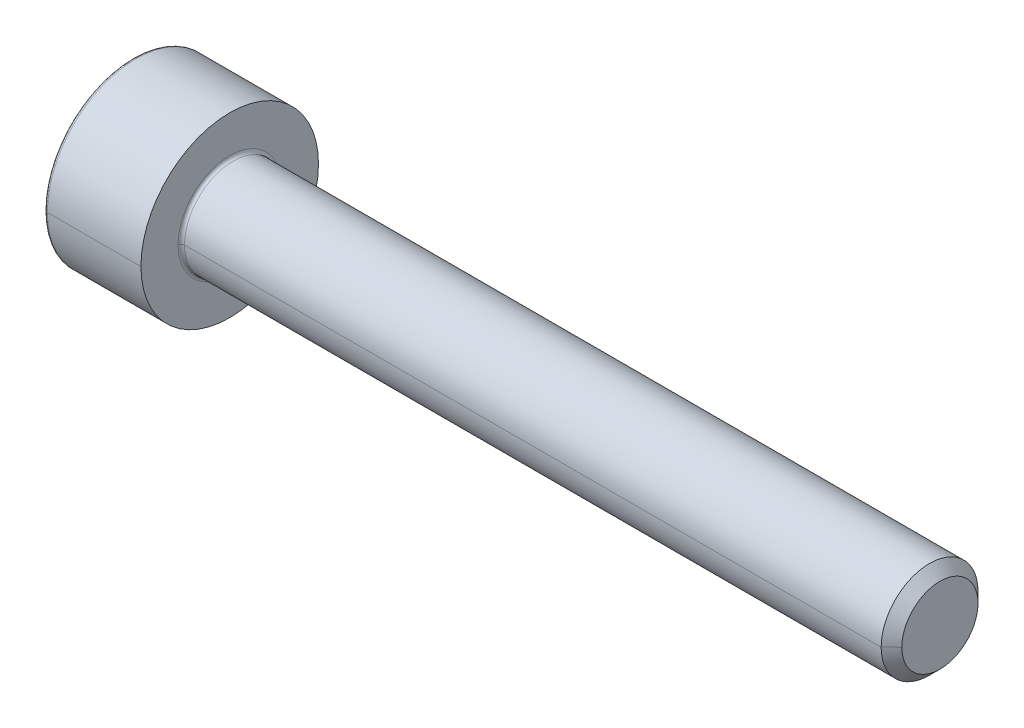
ISO-10303-21;
HEADER;
FILE_DESCRIPTION(('STEP AP214'),'2;1');
FILE_NAME('part.step','',(''),(''),'','','');
FILE_SCHEMA(('AUTOMOTIVE_DESIGN { 1 0 10303 214 1 1 1 1 }'));
ENDSEC;
DATA;
#1=APPLICATION_CONTEXT('core data for automotive mechanical design processes');
#2=APPLICATION_PROTOCOL_DEFINITION('international standard','automotive_design',2000,#1);
#3=PRODUCT_CONTEXT('',#1,'mechanical');
#4=PRODUCT('Part','Part','',(#3));
#5=PRODUCT_RELATED_PRODUCT_CATEGORY('part','',(#4));
#6=PRODUCT_DEFINITION_FORMATION('','',#4);
#7=PRODUCT_DEFINITION_CONTEXT('part definition',#1,'design');
#8=PRODUCT_DEFINITION('design','',#6,#7);
#9=PRODUCT_DEFINITION_SHAPE('','',#8);
#10=(LENGTH_UNIT() NAMED_UNIT(*) SI_UNIT(.MILLI.,.METRE.));
#11=(NAMED_UNIT(*) PLANE_ANGLE_UNIT() SI_UNIT($,.RADIAN.));
#12=(NAMED_UNIT(*) SI_UNIT($,.STERADIAN.) SOLID_ANGLE_UNIT());
#13=UNCERTAINTY_MEASURE_WITH_UNIT(LENGTH_MEASURE(1.E-05),#10,'distance_accuracy_value','');
#14=(GEOMETRIC_REPRESENTATION_CONTEXT(3) GLOBAL_UNCERTAINTY_ASSIGNED_CONTEXT((#13)) GLOBAL_UNIT_ASSIGNED_CONTEXT((#10,
#11,#12)) REPRESENTATION_CONTEXT('',''));
#15=CARTESIAN_POINT('',(0.,0.,0.));
#16=DIRECTION('',(0.,0.,1.));
#17=DIRECTION('',(1.,0.,0.));
#18=AXIS2_PLACEMENT_3D('',#15,#16,#17);
#19=CARTESIAN_POINT('',(1.3,-0.7175,1.242746454431));
#20=DIRECTION('',(-1.,0.,0.));
#21=DIRECTION('',(0.,0.,1.));
#22=AXIS2_PLACEMENT_3D('',#19,#20,#21);
#23=PLANE('',#22);
#24=DIRECTION('',(0.,-1.,0.));
#25=VECTOR('',#24,1.);
#26=CARTESIAN_POINT('',(1.3,0.7175,1.242746454431));
#27=LINE('',#26,#25);
#28=CARTESIAN_POINT('',(1.3,0.7175,1.242746454431));
#29=VERTEX_POINT('',#28);
#30=CARTESIAN_POINT('',(1.3,-0.7174999999999,1.242746454431));
#31=VERTEX_POINT('',#30);
#32=EDGE_CURVE('E30',#29,#31,#27,.T.);
#33=ORIENTED_EDGE('',*,*,#32,.F.);
#34=DIRECTION('',(0.,-0.499999999999973,0.866025403784454));
#35=VECTOR('',#34,1.);
#36=CARTESIAN_POINT('',(1.3,1.435,0.));
#37=LINE('',#36,#35);
#38=CARTESIAN_POINT('',(1.3,1.435,0.));
#39=VERTEX_POINT('',#38);
#40=EDGE_CURVE('E45',#39,#29,#37,.T.);
#41=ORIENTED_EDGE('',*,*,#40,.F.);
#42=DIRECTION('',(0.,0.500000000000017,0.866025403784429));
#43=VECTOR('',#42,1.);
#44=CARTESIAN_POINT('',(1.3,0.7174999999999,-1.242746454431));
#45=LINE('',#44,#43);
#46=CARTESIAN_POINT('',(1.3,0.7174999999999,-1.242746454431));
#47=VERTEX_POINT('',#46);
#48=EDGE_CURVE('E330',#47,#39,#45,.T.);
#49=ORIENTED_EDGE('',*,*,#48,.F.);
#50=DIRECTION('',(0.,1.,0.));
#51=VECTOR('',#50,1.);
#52=CARTESIAN_POINT('',(1.3,-0.7175,-1.242746454431));
#53=LINE('',#52,#51);
#54=CARTESIAN_POINT('',(1.3,-0.7175,-1.242746454431));
#55=VERTEX_POINT('',#54);
#56=EDGE_CURVE('E322',#55,#47,#53,.T.);
#57=ORIENTED_EDGE('',*,*,#56,.F.);
#58=DIRECTION('',(0.,0.499999999999973,-0.866025403784454));
#59=VECTOR('',#58,1.);
#60=CARTESIAN_POINT('',(1.3,-1.435,0.));
#61=LINE('',#60,#59);
#62=CARTESIAN_POINT('',(1.3,-1.435,0.));
#63=VERTEX_POINT('',#62);
#64=EDGE_CURVE('E301',#63,#55,#61,.T.);
#65=ORIENTED_EDGE('',*,*,#64,.F.);
#66=DIRECTION('',(0.,-0.500000000000017,-0.866025403784429));
#67=VECTOR('',#66,1.);
#68=CARTESIAN_POINT('',(1.3,-0.7174999999999,1.242746454431));
#69=LINE('',#68,#67);
#70=EDGE_CURVE('E383',#31,#63,#69,.T.);
#71=ORIENTED_EDGE('',*,*,#70,.F.);
#72=EDGE_LOOP('',(#33,#41,#49,#57,#65,#71));
#73=FACE_BOUND('',#72,.T.);
#74=ADVANCED_FACE('F17',(#73),#23,.T.);
#75=CARTESIAN_POINT('',(1.3,-0.7175,1.242746454431));
#76=DIRECTION('',(0.,0.,1.));
#77=DIRECTION('',(1.,0.,0.));
#78=AXIS2_PLACEMENT_3D('',#75,#76,#77);
#79=PLANE('',#78);
#80=DIRECTION('',(1.,0.,0.));
#81=VECTOR('',#80,1.);
#82=CARTESIAN_POINT('',(0.,0.7174999999999,1.242746454431));
#83=LINE('',#82,#81);
#84=CARTESIAN_POINT('',(0.,0.7174999999999,1.242746454431));
#85=VERTEX_POINT('',#84);
#86=EDGE_CURVE('E11',#85,#29,#83,.T.);
#87=ORIENTED_EDGE('',*,*,#86,.T.);
#88=ORIENTED_EDGE('',*,*,#32,.T.);
#89=DIRECTION('',(1.,0.,0.));
#90=VECTOR('',#89,1.);
#91=CARTESIAN_POINT('',(0.,-0.7174999999998,1.242746454431));
#92=LINE('',#91,#90);
#93=CARTESIAN_POINT('',(0.,-0.7174999999998,1.242746454431));
#94=VERTEX_POINT('',#93);
#95=EDGE_CURVE('E302',#94,#31,#92,.T.);
#96=ORIENTED_EDGE('',*,*,#95,.F.);
#97=DIRECTION('',(0.,-1.,0.));
#98=VECTOR('',#97,1.);
#99=CARTESIAN_POINT('',(0.,0.7174999999999,1.242746454431));
#100=LINE('',#99,#98);
#101=EDGE_CURVE('E293',#85,#94,#100,.T.);
#102=ORIENTED_EDGE('',*,*,#101,.F.);
#103=EDGE_LOOP('',(#87,#88,#96,#102));
#104=FACE_BOUND('',#103,.T.);
#105=ADVANCED_FACE('F210',(#104),#79,.F.);
#106=CARTESIAN_POINT('',(1.3,0.7175,1.242746454431));
#107=DIRECTION('',(0.,0.866025403784429,0.500000000000017));
#108=DIRECTION('',(1.,0.,0.));
#109=AXIS2_PLACEMENT_3D('',#106,#107,#108);
#110=PLANE('',#109);
#111=DIRECTION('',(1.,0.,0.));
#112=VECTOR('',#111,1.);
#113=CARTESIAN_POINT('',(0.,1.435,0.));
#114=LINE('',#113,#112);
#115=CARTESIAN_POINT('',(0.,1.435,0.));
#116=VERTEX_POINT('',#115);
#117=EDGE_CURVE('E309',#116,#39,#114,.T.);
#118=ORIENTED_EDGE('',*,*,#117,.T.);
#119=ORIENTED_EDGE('',*,*,#40,.T.);
#120=ORIENTED_EDGE('',*,*,#86,.F.);
#121=DIRECTION('',(0.,0.499999999999973,-0.866025403784454));
#122=VECTOR('',#121,1.);
#123=CARTESIAN_POINT('',(0.,0.7174999999999,1.242746454431));
#124=LINE('',#123,#122);
#125=EDGE_CURVE('E368',#85,#116,#124,.T.);
#126=ORIENTED_EDGE('',*,*,#125,.T.);
#127=EDGE_LOOP('',(#118,#119,#120,#126));
#128=FACE_BOUND('',#127,.T.);
#129=ADVANCED_FACE('F216',(#128),#110,.F.);
#130=CARTESIAN_POINT('',(1.3,1.435,0.));
#131=DIRECTION('',(0.,0.866025403784429,-0.500000000000017));
#132=DIRECTION('',(-1.,0.,0.));
#133=AXIS2_PLACEMENT_3D('',#130,#131,#132);
#134=PLANE('',#133);
#135=DIRECTION('',(1.,0.,0.));
#136=VECTOR('',#135,1.);
#137=CARTESIAN_POINT('',(0.,0.7174999999998,-1.242746454431));
#138=LINE('',#137,#136);
#139=CARTESIAN_POINT('',(0.,0.7174999999998,-1.242746454431));
#140=VERTEX_POINT('',#139);
#141=EDGE_CURVE('E374',#140,#47,#138,.T.);
#142=ORIENTED_EDGE('',*,*,#141,.T.);
#143=ORIENTED_EDGE('',*,*,#48,.T.);
#144=ORIENTED_EDGE('',*,*,#117,.F.);
#145=DIRECTION('',(0.,-0.500000000000017,-0.866025403784429));
#146=VECTOR('',#145,1.);
#147=CARTESIAN_POINT('',(0.,1.435,0.));
#148=LINE('',#147,#146);
#149=EDGE_CURVE('E321',#116,#140,#148,.T.);
#150=ORIENTED_EDGE('',*,*,#149,.T.);
#151=EDGE_LOOP('',(#142,#143,#144,#150));
#152=FACE_BOUND('',#151,.T.);
#153=ADVANCED_FACE('F225',(#152),#134,.F.);
#154=CARTESIAN_POINT('',(1.3,0.7175,-1.242746454431));
#155=DIRECTION('',(0.,0.,-1.));
#156=DIRECTION('',(0.,-1.,0.));
#157=AXIS2_PLACEMENT_3D('',#154,#155,#156);
#158=PLANE('',#157);
#159=DIRECTION('',(1.,0.,0.));
#160=VECTOR('',#159,1.);
#161=CARTESIAN_POINT('',(0.,-0.7174999999999,-1.242746454431));
#162=LINE('',#161,#160);
#163=CARTESIAN_POINT('',(0.,-0.7174999999999,-1.242746454431));
#164=VERTEX_POINT('',#163);
#165=EDGE_CURVE('E318',#164,#55,#162,.T.);
#166=ORIENTED_EDGE('',*,*,#165,.T.);
#167=ORIENTED_EDGE('',*,*,#56,.T.);
#168=ORIENTED_EDGE('',*,*,#141,.F.);
#169=DIRECTION('',(0.,1.,0.));
#170=VECTOR('',#169,1.);
#171=CARTESIAN_POINT('',(0.,-0.7174999999999,-1.242746454431));
#172=LINE('',#171,#170);
#173=EDGE_CURVE('E297',#164,#140,#172,.T.);
#174=ORIENTED_EDGE('',*,*,#173,.F.);
#175=EDGE_LOOP('',(#166,#167,#168,#174));
#176=FACE_BOUND('',#175,.T.);
#177=ADVANCED_FACE('F222',(#176),#158,.F.);
#178=CARTESIAN_POINT('',(1.3,-0.7175,-1.242746454431));
#179=DIRECTION('',(0.,-0.866025403784429,-0.500000000000017));
#180=DIRECTION('',(0.,0.500000000000017,-0.866025403784429));
#181=AXIS2_PLACEMENT_3D('',#178,#179,#180);
#182=PLANE('',#181);
#183=DIRECTION('',(1.,0.,0.));
#184=VECTOR('',#183,1.);
#185=CARTESIAN_POINT('',(0.,-1.435,0.));
#186=LINE('',#185,#184);
#187=CARTESIAN_POINT('',(0.,-1.435,0.));
#188=VERTEX_POINT('',#187);
#189=EDGE_CURVE('E333',#188,#63,#186,.T.);
#190=ORIENTED_EDGE('',*,*,#189,.T.);
#191=ORIENTED_EDGE('',*,*,#64,.T.);
#192=ORIENTED_EDGE('',*,*,#165,.F.);
#193=DIRECTION('',(0.,-0.499999999999973,0.866025403784454));
#194=VECTOR('',#193,1.);
#195=CARTESIAN_POINT('',(0.,-0.7174999999999,-1.242746454431));
#196=LINE('',#195,#194);
#197=EDGE_CURVE('E298',#164,#188,#196,.T.);
#198=ORIENTED_EDGE('',*,*,#197,.T.);
#199=EDGE_LOOP('',(#190,#191,#192,#198));
#200=FACE_BOUND('',#199,.T.);
#201=ADVANCED_FACE('F197',(#200),#182,.F.);
#202=CARTESIAN_POINT('',(1.3,-1.435,0.));
#203=DIRECTION('',(0.,-0.866025403784429,0.500000000000017));
#204=DIRECTION('',(-1.,0.,0.));
#205=AXIS2_PLACEMENT_3D('',#202,#203,#204);
#206=PLANE('',#205);
#207=ORIENTED_EDGE('',*,*,#95,.T.);
#208=ORIENTED_EDGE('',*,*,#70,.T.);
#209=ORIENTED_EDGE('',*,*,#189,.F.);
#210=DIRECTION('',(0.,0.500000000000017,0.866025403784429));
#211=VECTOR('',#210,1.);
#212=CARTESIAN_POINT('',(0.,-1.435,0.));
#213=LINE('',#212,#211);
#214=EDGE_CURVE('E345',#188,#94,#213,.T.);
#215=ORIENTED_EDGE('',*,*,#214,.T.);
#216=EDGE_LOOP('',(#207,#208,#209,#215));
#217=FACE_BOUND('',#216,.T.);
#218=ADVANCED_FACE('F194',(#217),#206,.F.);
#219=CARTESIAN_POINT('',(0.,0.,0.));
#220=DIRECTION('',(-1.,0.,0.));
#221=DIRECTION('',(0.,0.,1.));
#222=AXIS2_PLACEMENT_3D('',#219,#220,#221);
#223=PLANE('',#222);
#224=CARTESIAN_POINT('',(0.,0.,0.));
#225=DIRECTION('',(1.,0.,0.));
#226=DIRECTION('',(0.,0.,1.));
#227=AXIS2_PLACEMENT_3D('',#224,#225,#226);
#228=CIRCLE('',#227,2.65);
#229=CARTESIAN_POINT('',(0.,0.,2.65));
#230=VERTEX_POINT('',#229);
#231=CARTESIAN_POINT('',(0.,0.,-2.65));
#232=VERTEX_POINT('',#231);
#233=EDGE_CURVE('E313',#230,#232,#228,.T.);
#234=ORIENTED_EDGE('',*,*,#233,.F.);
#235=CARTESIAN_POINT('',(0.,0.,0.));
#236=DIRECTION('',(1.,0.,0.));
#237=DIRECTION('',(0.,0.,-1.));
#238=AXIS2_PLACEMENT_3D('',#235,#236,#237);
#239=CIRCLE('',#238,2.65);
#240=EDGE_CURVE('E284',#232,#230,#239,.T.);
#241=ORIENTED_EDGE('',*,*,#240,.F.);
#242=EDGE_LOOP('',(#234,#241));
#243=FACE_BOUND('',#242,.T.);
#244=ORIENTED_EDGE('',*,*,#197,.F.);
#245=ORIENTED_EDGE('',*,*,#173,.T.);
#246=ORIENTED_EDGE('',*,*,#149,.F.);
#247=ORIENTED_EDGE('',*,*,#125,.F.);
#248=ORIENTED_EDGE('',*,*,#101,.T.);
#249=ORIENTED_EDGE('',*,*,#214,.F.);
#250=EDGE_LOOP('',(#244,#245,#246,#247,#248,#249));
#251=FACE_BOUND('',#250,.T.);
#252=ADVANCED_FACE('F196',(#243,#251),#223,.T.);
#253=CARTESIAN_POINT('',(25.,1.5,0.));
#254=DIRECTION('',(1.,0.,0.));
#255=DIRECTION('',(0.,1.,0.));
#256=AXIS2_PLACEMENT_3D('',#253,#254,#255);
#257=PLANE('',#256);
#258=CARTESIAN_POINT('',(24.99999043726,0.,0.));
#259=DIRECTION('',(-1.,0.,0.));
#260=DIRECTION('',(0.,0.,1.));
#261=AXIS2_PLACEMENT_3D('',#258,#259,#260);
#262=CIRCLE('',#261,1.17998873201);
#263=CARTESIAN_POINT('',(24.99999362484,5.068852330687E-12,1.17998873201));
#264=VERTEX_POINT('',#263);
#265=CARTESIAN_POINT('',(24.99999043726,0.,-1.17998873201));
#266=VERTEX_POINT('',#265);
#267=EDGE_CURVE('E161',#264,#266,#262,.T.);
#268=ORIENTED_EDGE('',*,*,#267,.F.);
#269=CARTESIAN_POINT('',(24.99999043726,0.,0.));
#270=DIRECTION('',(-1.,0.,0.));
#271=DIRECTION('',(0.,0.,-1.));
#272=AXIS2_PLACEMENT_3D('',#269,#270,#271);
#273=CIRCLE('',#272,1.17998873201);
#274=EDGE_CURVE('E165',#266,#264,#273,.T.);
#275=ORIENTED_EDGE('',*,*,#274,.F.);
#276=EDGE_LOOP('',(#268,#275));
#277=FACE_BOUND('',#276,.T.);
#278=ADVANCED_FACE('F19',(#277),#257,.T.);
#279=CARTESIAN_POINT('',(0.,0.,0.));
#280=DIRECTION('',(1.,0.,0.));
#281=DIRECTION('',(0.,0.,-1.));
#282=AXIS2_PLACEMENT_3D('',#279,#280,#281);
#283=CYLINDRICAL_SURFACE('',#282,1.5);
#284=DIRECTION('',(0.99999999999996,0.,2.8119300091279E-07));
#285=VECTOR('',#284,1.);
#286=CARTESIAN_POINT('',(3.1,0.,-1.5));
#287=LINE('',#286,#285);
#288=CARTESIAN_POINT('',(3.1,0.,-1.5));
#289=VERTEX_POINT('',#288);
#290=CARTESIAN_POINT('',(24.6799856565,0.,-1.499987863718));
#291=VERTEX_POINT('',#290);
#292=EDGE_CURVE('E140',#289,#291,#287,.T.);
#293=ORIENTED_EDGE('',*,*,#292,.F.);
#294=CARTESIAN_POINT('',(3.1,0.,0.));
#295=DIRECTION('',(1.,0.,0.));
#296=DIRECTION('',(0.,0.,-1.));
#297=AXIS2_PLACEMENT_3D('',#294,#295,#296);
#298=CIRCLE('',#297,1.5);
#299=CARTESIAN_POINT('',(3.1,0.,1.5));
#300=VERTEX_POINT('',#299);
#301=EDGE_CURVE('E170',#289,#300,#298,.T.);
#302=ORIENTED_EDGE('',*,*,#301,.T.);
#303=DIRECTION('',(-0.99999999999996,-2.23937962950991E-13,2.8119300091279E-07));
#304=VECTOR('',#303,1.);
#305=CARTESIAN_POINT('',(24.6799856565,8.085160076087E-12,1.499993931859));
#306=LINE('',#305,#304);
#307=CARTESIAN_POINT('',(24.6799856565,6.504261639023E-12,1.499987863718));
#308=VERTEX_POINT('',#307);
#309=EDGE_CURVE('E126',#308,#300,#306,.T.);
#310=ORIENTED_EDGE('',*,*,#309,.F.);
#311=CARTESIAN_POINT('',(24.6799856565,0.,0.));
#312=DIRECTION('',(-1.,0.,0.));
#313=DIRECTION('',(0.,4.33798586649533E-12,1.));
#314=AXIS2_PLACEMENT_3D('',#311,#312,#313);
#315=CIRCLE('',#314,1.5);
#316=EDGE_CURVE('E157',#308,#291,#315,.T.);
#317=ORIENTED_EDGE('',*,*,#316,.T.);
#318=EDGE_LOOP('',(#293,#302,#310,#317));
#319=FACE_BOUND('',#318,.T.);
#320=ADVANCED_FACE('F168',(#319),#283,.T.);
#321=CARTESIAN_POINT('',(24.83998804688,0.,0.));
#322=DIRECTION('',(-1.,0.,0.));
#323=DIRECTION('',(0.,0.,-1.));
#324=AXIS2_PLACEMENT_3D('',#321,#322,#323);
#325=CONICAL_SURFACE('',#324,1.339988297864,0.785389336811567);
#326=DIRECTION('',(0.707109839894982,-6.66502430547983E-12,-0.707103722464882));
#327=VECTOR('',#326,1.);
#328=CARTESIAN_POINT('',(24.6799856565,8.085160076087E-12,1.499993931859));
#329=LINE('',#328,#327);
#330=EDGE_CURVE('E171',#308,#264,#329,.T.);
#331=ORIENTED_EDGE('',*,*,#330,.T.);
#332=ORIENTED_EDGE('',*,*,#267,.T.);
#333=DIRECTION('',(0.707109839894982,0.,0.707103722464882));
#334=VECTOR('',#333,1.);
#335=CARTESIAN_POINT('',(24.6799856565,0.,-1.499993931859));
#336=LINE('',#335,#334);
#337=EDGE_CURVE('E154',#291,#266,#336,.T.);
#338=ORIENTED_EDGE('',*,*,#337,.F.);
#339=ORIENTED_EDGE('',*,*,#316,.F.);
#340=EDGE_LOOP('',(#331,#332,#338,#339));
#341=FACE_BOUND('',#340,.T.);
#342=ADVANCED_FACE('F156',(#341),#325,.T.);
#343=CARTESIAN_POINT('',(24.83998804688,0.,0.));
#344=DIRECTION('',(-1.,0.,0.));
#345=DIRECTION('',(0.,0.,-1.));
#346=AXIS2_PLACEMENT_3D('',#343,#344,#345);
#347=CONICAL_SURFACE('',#346,1.339988297864,0.785389336811567);
#348=ORIENTED_EDGE('',*,*,#337,.T.);
#349=ORIENTED_EDGE('',*,*,#274,.T.);
#350=ORIENTED_EDGE('',*,*,#330,.F.);
#351=CARTESIAN_POINT('',(24.6799856565,0.,0.));
#352=DIRECTION('',(-1.,0.,0.));
#353=DIRECTION('',(0.,0.,-1.));
#354=AXIS2_PLACEMENT_3D('',#351,#352,#353);
#355=CIRCLE('',#354,1.5);
#356=EDGE_CURVE('E144',#291,#308,#355,.T.);
#357=ORIENTED_EDGE('',*,*,#356,.F.);
#358=EDGE_LOOP('',(#348,#349,#350,#357));
#359=FACE_BOUND('',#358,.T.);
#360=ADVANCED_FACE('F174',(#359),#347,.T.);
#361=CARTESIAN_POINT('',(0.,0.,0.));
#362=DIRECTION('',(1.,0.,0.));
#363=DIRECTION('',(0.,0.,-1.));
#364=AXIS2_PLACEMENT_3D('',#361,#362,#363);
#365=CYLINDRICAL_SURFACE('',#364,1.5);
#366=ORIENTED_EDGE('',*,*,#309,.T.);
#367=CARTESIAN_POINT('',(3.1,0.,0.));
#368=DIRECTION('',(1.,0.,0.));
#369=DIRECTION('',(0.,4.336653598866E-12,1.));
#370=AXIS2_PLACEMENT_3D('',#367,#368,#369);
#371=CIRCLE('',#370,1.5);
#372=EDGE_CURVE('E146',#300,#289,#371,.T.);
#373=ORIENTED_EDGE('',*,*,#372,.T.);
#374=ORIENTED_EDGE('',*,*,#292,.T.);
#375=ORIENTED_EDGE('',*,*,#356,.T.);
#376=EDGE_LOOP('',(#366,#373,#374,#375));
#377=FACE_BOUND('',#376,.T.);
#378=ADVANCED_FACE('F142',(#377),#365,.T.);
#379=CARTESIAN_POINT('',(3.1,0.,0.));
#380=DIRECTION('',(1.,0.,0.));
#381=DIRECTION('',(0.,0.,-1.));
#382=AXIS2_PLACEMENT_3D('',#379,#380,#381);
#383=TOROIDAL_SURFACE('',#382,1.6,0.1);
#384=CARTESIAN_POINT('',(3.1,0.,1.6));
#385=DIRECTION('',(0.,-1.,0.));
#386=DIRECTION('',(-1.,0.,0.));
#387=AXIS2_PLACEMENT_3D('',#384,#385,#386);
#388=CIRCLE('',#387,0.1);
#389=CARTESIAN_POINT('',(3.,0.,1.6));
#390=VERTEX_POINT('',#389);
#391=EDGE_CURVE('E354',#390,#300,#388,.T.);
#392=ORIENTED_EDGE('',*,*,#391,.F.);
#393=CARTESIAN_POINT('',(3.,0.,0.));
#394=DIRECTION('',(1.,0.,0.));
#395=DIRECTION('',(0.,0.,1.));
#396=AXIS2_PLACEMENT_3D('',#393,#394,#395);
#397=CIRCLE('',#396,1.6);
#398=CARTESIAN_POINT('',(3.,0.,-1.6));
#399=VERTEX_POINT('',#398);
#400=EDGE_CURVE('E176',#390,#399,#397,.T.);
#401=ORIENTED_EDGE('',*,*,#400,.T.);
#402=CARTESIAN_POINT('',(3.1,0.,-1.6));
#403=DIRECTION('',(0.,1.,0.));
#404=DIRECTION('',(-1.,0.,0.));
#405=AXIS2_PLACEMENT_3D('',#402,#403,#404);
#406=CIRCLE('',#405,0.1);
#407=EDGE_CURVE('E278',#399,#289,#406,.T.);
#408=ORIENTED_EDGE('',*,*,#407,.T.);
#409=ORIENTED_EDGE('',*,*,#372,.F.);
#410=EDGE_LOOP('',(#392,#401,#408,#409));
#411=FACE_BOUND('',#410,.T.);
#412=ADVANCED_FACE('F191',(#411),#383,.F.);
#413=CARTESIAN_POINT('',(3.1,0.,0.));
#414=DIRECTION('',(1.,0.,0.));
#415=DIRECTION('',(0.,0.,-1.));
#416=AXIS2_PLACEMENT_3D('',#413,#414,#415);
#417=TOROIDAL_SURFACE('',#416,1.6,0.1);
#418=ORIENTED_EDGE('',*,*,#301,.F.);
#419=ORIENTED_EDGE('',*,*,#407,.F.);
#420=CARTESIAN_POINT('',(3.,0.,0.));
#421=DIRECTION('',(1.,0.,0.));
#422=DIRECTION('',(0.,0.,-1.));
#423=AXIS2_PLACEMENT_3D('',#420,#421,#422);
#424=CIRCLE('',#423,1.6);
#425=EDGE_CURVE('E281',#399,#390,#424,.T.);
#426=ORIENTED_EDGE('',*,*,#425,.T.);
#427=ORIENTED_EDGE('',*,*,#391,.T.);
#428=EDGE_LOOP('',(#418,#419,#426,#427));
#429=FACE_BOUND('',#428,.T.);
#430=ADVANCED_FACE('F192',(#429),#417,.F.);
#431=CARTESIAN_POINT('',(3.,2.75,0.));
#432=DIRECTION('',(1.,0.,0.));
#433=DIRECTION('',(0.,1.,0.));
#434=AXIS2_PLACEMENT_3D('',#431,#432,#433);
#435=PLANE('',#434);
#436=CARTESIAN_POINT('',(3.,0.,0.));
#437=DIRECTION('',(-1.,0.,0.));
#438=DIRECTION('',(0.,0.,-1.));
#439=AXIS2_PLACEMENT_3D('',#436,#437,#438);
#440=CIRCLE('',#439,2.75);
#441=CARTESIAN_POINT('',(3.,0.,-2.75));
#442=VERTEX_POINT('',#441);
#443=CARTESIAN_POINT('',(3.,0.,2.75));
#444=VERTEX_POINT('',#443);
#445=EDGE_CURVE('E316',#442,#444,#440,.T.);
#446=ORIENTED_EDGE('',*,*,#445,.F.);
#447=CARTESIAN_POINT('',(3.,0.,0.));
#448=DIRECTION('',(-1.,0.,0.));
#449=DIRECTION('',(0.,0.,1.));
#450=AXIS2_PLACEMENT_3D('',#447,#448,#449);
#451=CIRCLE('',#450,2.75);
#452=EDGE_CURVE('E75',#444,#442,#451,.T.);
#453=ORIENTED_EDGE('',*,*,#452,.F.);
#454=EDGE_LOOP('',(#446,#453));
#455=FACE_BOUND('',#454,.T.);
#456=ORIENTED_EDGE('',*,*,#400,.F.);
#457=ORIENTED_EDGE('',*,*,#425,.F.);
#458=EDGE_LOOP('',(#456,#457));
#459=FACE_BOUND('',#458,.T.);
#460=ADVANCED_FACE('F207',(#455,#459),#435,.T.);
#461=CARTESIAN_POINT('',(0.,0.,0.));
#462=DIRECTION('',(1.,0.,0.));
#463=DIRECTION('',(0.,0.,-1.));
#464=AXIS2_PLACEMENT_3D('',#461,#462,#463);
#465=CYLINDRICAL_SURFACE('',#464,2.75);
#466=CARTESIAN_POINT('',(0.1,0.,0.));
#467=DIRECTION('',(1.,0.,0.));
#468=DIRECTION('',(0.,0.,1.));
#469=AXIS2_PLACEMENT_3D('',#466,#467,#468);
#470=CIRCLE('',#469,2.75);
#471=CARTESIAN_POINT('',(0.1,0.,2.75));
#472=VERTEX_POINT('',#471);
#473=CARTESIAN_POINT('',(0.1,0.,-2.75));
#474=VERTEX_POINT('',#473);
#475=EDGE_CURVE('E360',#472,#474,#470,.T.);
#476=ORIENTED_EDGE('',*,*,#475,.T.);
#477=DIRECTION('',(-1.,0.,0.));
#478=VECTOR('',#477,1.);
#479=CARTESIAN_POINT('',(3.,0.,-2.75));
#480=LINE('',#479,#478);
#481=EDGE_CURVE('E292',#442,#474,#480,.T.);
#482=ORIENTED_EDGE('',*,*,#481,.F.);
#483=ORIENTED_EDGE('',*,*,#445,.T.);
#484=DIRECTION('',(-1.,0.,0.));
#485=VECTOR('',#484,1.);
#486=CARTESIAN_POINT('',(3.,0.,2.75));
#487=LINE('',#486,#485);
#488=EDGE_CURVE('E291',#444,#472,#487,.T.);
#489=ORIENTED_EDGE('',*,*,#488,.T.);
#490=EDGE_LOOP('',(#476,#482,#483,#489));
#491=FACE_BOUND('',#490,.T.);
#492=ADVANCED_FACE('F227',(#491),#465,.T.);
#493=CARTESIAN_POINT('',(0.,0.,0.));
#494=DIRECTION('',(1.,0.,0.));
#495=DIRECTION('',(0.,0.,-1.));
#496=AXIS2_PLACEMENT_3D('',#493,#494,#495);
#497=CYLINDRICAL_SURFACE('',#496,2.75);
#498=ORIENTED_EDGE('',*,*,#488,.F.);
#499=ORIENTED_EDGE('',*,*,#452,.T.);
#500=ORIENTED_EDGE('',*,*,#481,.T.);
#501=CARTESIAN_POINT('',(0.1,0.,0.));
#502=DIRECTION('',(1.,0.,0.));
#503=DIRECTION('',(0.,0.,-1.));
#504=AXIS2_PLACEMENT_3D('',#501,#502,#503);
#505=CIRCLE('',#504,2.75);
#506=EDGE_CURVE('E98',#474,#472,#505,.T.);
#507=ORIENTED_EDGE('',*,*,#506,.T.);
#508=EDGE_LOOP('',(#498,#499,#500,#507));
#509=FACE_BOUND('',#508,.T.);
#510=ADVANCED_FACE('F230',(#509),#497,.T.);
#511=CARTESIAN_POINT('',(0.1,0.,0.));
#512=DIRECTION('',(-1.,0.,0.));
#513=DIRECTION('',(0.,0.,1.));
#514=AXIS2_PLACEMENT_3D('',#511,#512,#513);
#515=TOROIDAL_SURFACE('',#514,2.65,0.1);
#516=CARTESIAN_POINT('',(0.1,0.,-2.65));
#517=DIRECTION('',(0.,-1.,0.));
#518=DIRECTION('',(-1.,0.,0.));
#519=AXIS2_PLACEMENT_3D('',#516,#517,#518);
#520=CIRCLE('',#519,0.1);
#521=EDGE_CURVE('E310',#232,#474,#520,.T.);
#522=ORIENTED_EDGE('',*,*,#521,.F.);
#523=ORIENTED_EDGE('',*,*,#240,.T.);
#524=CARTESIAN_POINT('',(0.1,0.,2.65));
#525=DIRECTION('',(0.,1.,0.));
#526=DIRECTION('',(-1.,0.,0.));
#527=AXIS2_PLACEMENT_3D('',#524,#525,#526);
#528=CIRCLE('',#527,0.1);
#529=EDGE_CURVE('E288',#230,#472,#528,.T.);
#530=ORIENTED_EDGE('',*,*,#529,.T.);
#531=ORIENTED_EDGE('',*,*,#506,.F.);
#532=EDGE_LOOP('',(#522,#523,#530,#531));
#533=FACE_BOUND('',#532,.T.);
#534=ADVANCED_FACE('F243',(#533),#515,.T.);
#535=CARTESIAN_POINT('',(0.1,0.,0.));
#536=DIRECTION('',(-1.,0.,0.));
#537=DIRECTION('',(0.,0.,1.));
#538=AXIS2_PLACEMENT_3D('',#535,#536,#537);
#539=TOROIDAL_SURFACE('',#538,2.65,0.1);
#540=ORIENTED_EDGE('',*,*,#475,.F.);
#541=ORIENTED_EDGE('',*,*,#529,.F.);
#542=ORIENTED_EDGE('',*,*,#233,.T.);
#543=ORIENTED_EDGE('',*,*,#521,.T.);
#544=EDGE_LOOP('',(#540,#541,#542,#543));
#545=FACE_BOUND('',#544,.T.);
#546=ADVANCED_FACE('F220',(#545),#539,.T.);
#547=CLOSED_SHELL('',(#74,#105,#129,#153,#177,#201,#218,#252,#278,#320,#342,#360,#378,#412,#430,
#460,#492,#510,#534,#546));
#548=MANIFOLD_SOLID_BREP('B1',#547);
#549=ADVANCED_BREP_SHAPE_REPRESENTATION('',(#18,#548),#14);
#550=SHAPE_DEFINITION_REPRESENTATION(#9,#549);
ENDSEC;
END-ISO-10303-21;
